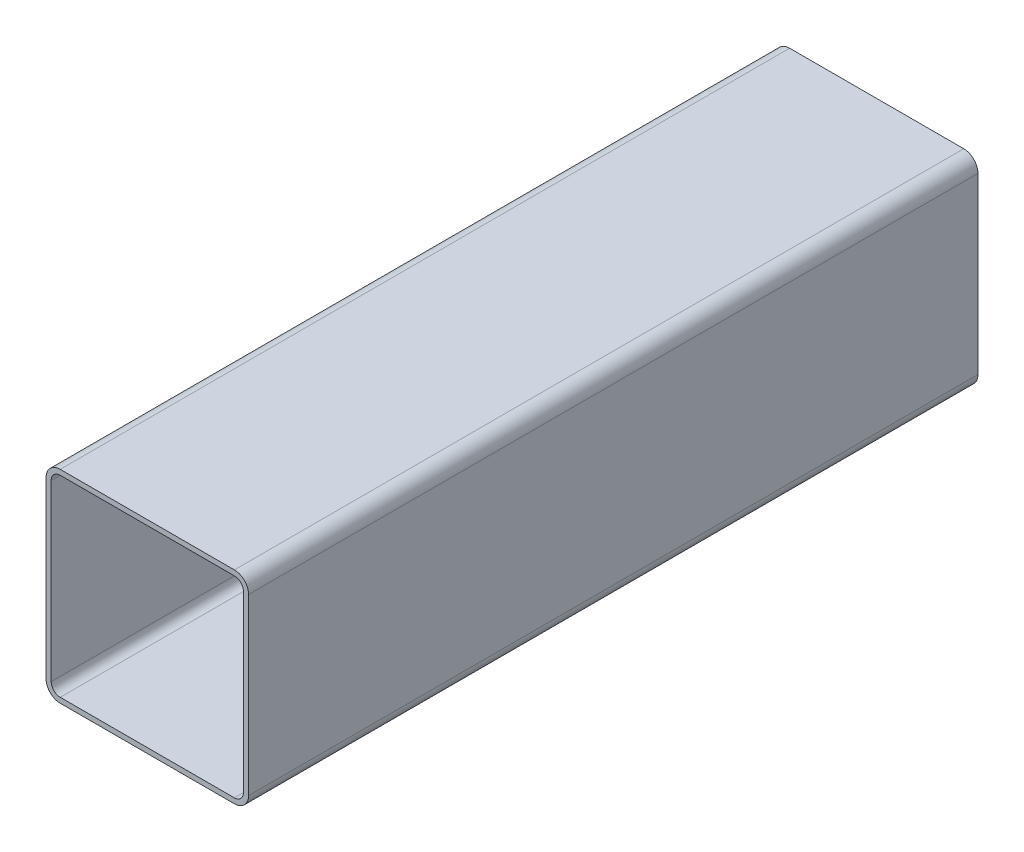
ISO-10303-21;
HEADER;
FILE_DESCRIPTION(('STEP AP214'),'2;1');
FILE_NAME('part.step','',(''),(''),'','','');
FILE_SCHEMA(('AUTOMOTIVE_DESIGN { 1 0 10303 214 1 1 1 1 }'));
ENDSEC;
DATA;
#1=APPLICATION_CONTEXT('core data for automotive mechanical design processes');
#2=APPLICATION_PROTOCOL_DEFINITION('international standard','automotive_design',2000,#1);
#3=PRODUCT_CONTEXT('',#1,'mechanical');
#4=PRODUCT('Part','Part','',(#3));
#5=PRODUCT_RELATED_PRODUCT_CATEGORY('part','',(#4));
#6=PRODUCT_DEFINITION_FORMATION('','',#4);
#7=PRODUCT_DEFINITION_CONTEXT('part definition',#1,'design');
#8=PRODUCT_DEFINITION('design','',#6,#7);
#9=PRODUCT_DEFINITION_SHAPE('','',#8);
#10=(LENGTH_UNIT() NAMED_UNIT(*) SI_UNIT(.MILLI.,.METRE.));
#11=(NAMED_UNIT(*) PLANE_ANGLE_UNIT() SI_UNIT($,.RADIAN.));
#12=(NAMED_UNIT(*) SI_UNIT($,.STERADIAN.) SOLID_ANGLE_UNIT());
#13=UNCERTAINTY_MEASURE_WITH_UNIT(LENGTH_MEASURE(1.E-05),#10,'distance_accuracy_value','');
#14=(GEOMETRIC_REPRESENTATION_CONTEXT(3) GLOBAL_UNCERTAINTY_ASSIGNED_CONTEXT((#13)) GLOBAL_UNIT_ASSIGNED_CONTEXT((#10,
#11,#12)) REPRESENTATION_CONTEXT('',''));
#15=CARTESIAN_POINT('',(0.,0.,0.));
#16=DIRECTION('',(0.,0.,1.));
#17=DIRECTION('',(1.,0.,0.));
#18=AXIS2_PLACEMENT_3D('',#15,#16,#17);
#19=CARTESIAN_POINT('',(36.3855,-36.3855,-304.8));
#20=DIRECTION('',(0.,0.,1.));
#21=DIRECTION('',(1.,0.,0.));
#22=AXIS2_PLACEMENT_3D('',#19,#20,#21);
#23=CYLINDRICAL_SURFACE('',#22,5.9436);
#24=CARTESIAN_POINT('',(36.3855,-36.3855,0.));
#25=DIRECTION('',(0.,0.,-1.));
#26=DIRECTION('',(-1.,0.,0.));
#27=AXIS2_PLACEMENT_3D('',#24,#25,#26);
#28=CIRCLE('',#27,5.9436);
#29=CARTESIAN_POINT('',(42.3291,-36.3855,0.));
#30=VERTEX_POINT('',#29);
#31=CARTESIAN_POINT('',(36.3855,-42.3291,0.));
#32=VERTEX_POINT('',#31);
#33=EDGE_CURVE('E234',#30,#32,#28,.T.);
#34=ORIENTED_EDGE('',*,*,#33,.T.);
#35=DIRECTION('',(0.,0.,1.));
#36=VECTOR('',#35,1.);
#37=CARTESIAN_POINT('',(36.3855,-42.3291,-304.8));
#38=LINE('',#37,#36);
#39=CARTESIAN_POINT('',(36.3855,-42.3291,-304.8));
#40=VERTEX_POINT('',#39);
#41=EDGE_CURVE('E12',#40,#32,#38,.T.);
#42=ORIENTED_EDGE('',*,*,#41,.F.);
#43=CARTESIAN_POINT('',(36.3855,-36.3855,-304.8));
#44=DIRECTION('',(0.,0.,-1.));
#45=DIRECTION('',(-1.,0.,0.));
#46=AXIS2_PLACEMENT_3D('',#43,#44,#45);
#47=CIRCLE('',#46,5.9436);
#48=CARTESIAN_POINT('',(42.3291,-36.3855,-304.8));
#49=VERTEX_POINT('',#48);
#50=EDGE_CURVE('E312',#49,#40,#47,.T.);
#51=ORIENTED_EDGE('',*,*,#50,.F.);
#52=DIRECTION('',(0.,0.,1.));
#53=VECTOR('',#52,1.);
#54=CARTESIAN_POINT('',(42.3291,-36.3855,-304.8));
#55=LINE('',#54,#53);
#56=EDGE_CURVE('E249',#49,#30,#55,.T.);
#57=ORIENTED_EDGE('',*,*,#56,.T.);
#58=EDGE_LOOP('',(#34,#42,#51,#57));
#59=FACE_BOUND('',#58,.T.);
#60=ADVANCED_FACE('F62',(#59),#23,.T.);
#61=CARTESIAN_POINT('',(36.3855,-42.3291,-304.8));
#62=DIRECTION('',(0.,1.,0.));
#63=DIRECTION('',(0.,0.,1.));
#64=AXIS2_PLACEMENT_3D('',#61,#62,#63);
#65=PLANE('',#64);
#66=DIRECTION('',(-1.,0.,0.));
#67=VECTOR('',#66,1.);
#68=CARTESIAN_POINT('',(36.3855,-42.3291,0.));
#69=LINE('',#68,#67);
#70=CARTESIAN_POINT('',(-36.3855,-42.3291,0.));
#71=VERTEX_POINT('',#70);
#72=EDGE_CURVE('E237',#32,#71,#69,.T.);
#73=ORIENTED_EDGE('',*,*,#72,.T.);
#74=DIRECTION('',(0.,0.,1.));
#75=VECTOR('',#74,1.);
#76=CARTESIAN_POINT('',(-36.3855,-42.3291,-304.8));
#77=LINE('',#76,#75);
#78=CARTESIAN_POINT('',(-36.3855,-42.3291,-304.8));
#79=VERTEX_POINT('',#78);
#80=EDGE_CURVE('E72',#79,#71,#77,.T.);
#81=ORIENTED_EDGE('',*,*,#80,.F.);
#82=DIRECTION('',(-1.,0.,0.));
#83=VECTOR('',#82,1.);
#84=CARTESIAN_POINT('',(36.3855,-42.3291,-304.8));
#85=LINE('',#84,#83);
#86=EDGE_CURVE('E314',#40,#79,#85,.T.);
#87=ORIENTED_EDGE('',*,*,#86,.F.);
#88=ORIENTED_EDGE('',*,*,#41,.T.);
#89=EDGE_LOOP('',(#73,#81,#87,#88));
#90=FACE_BOUND('',#89,.T.);
#91=ADVANCED_FACE('F349',(#90),#65,.F.);
#92=CARTESIAN_POINT('',(-36.3855,-36.3855,-304.8));
#93=DIRECTION('',(0.,0.,1.));
#94=DIRECTION('',(1.,0.,0.));
#95=AXIS2_PLACEMENT_3D('',#92,#93,#94);
#96=CYLINDRICAL_SURFACE('',#95,5.9436);
#97=CARTESIAN_POINT('',(-36.3855,-36.3855,0.));
#98=DIRECTION('',(0.,0.,-1.));
#99=DIRECTION('',(-1.,0.,0.));
#100=AXIS2_PLACEMENT_3D('',#97,#98,#99);
#101=CIRCLE('',#100,5.9436);
#102=CARTESIAN_POINT('',(-42.3291,-36.3855,0.));
#103=VERTEX_POINT('',#102);
#104=EDGE_CURVE('E239',#71,#103,#101,.T.);
#105=ORIENTED_EDGE('',*,*,#104,.T.);
#106=DIRECTION('',(0.,0.,1.));
#107=VECTOR('',#106,1.);
#108=CARTESIAN_POINT('',(-42.3291,-36.3855,-304.8));
#109=LINE('',#108,#107);
#110=CARTESIAN_POINT('',(-42.3291,-36.3855,-304.8));
#111=VERTEX_POINT('',#110);
#112=EDGE_CURVE('E256',#111,#103,#109,.T.);
#113=ORIENTED_EDGE('',*,*,#112,.F.);
#114=CARTESIAN_POINT('',(-36.3855,-36.3855,-304.8));
#115=DIRECTION('',(0.,0.,-1.));
#116=DIRECTION('',(-1.,0.,0.));
#117=AXIS2_PLACEMENT_3D('',#114,#115,#116);
#118=CIRCLE('',#117,5.9436);
#119=EDGE_CURVE('E316',#79,#111,#118,.T.);
#120=ORIENTED_EDGE('',*,*,#119,.F.);
#121=ORIENTED_EDGE('',*,*,#80,.T.);
#122=EDGE_LOOP('',(#105,#113,#120,#121));
#123=FACE_BOUND('',#122,.T.);
#124=ADVANCED_FACE('F354',(#123),#96,.T.);
#125=CARTESIAN_POINT('',(-42.3291,36.3855,-304.8));
#126=DIRECTION('',(1.,0.,0.));
#127=DIRECTION('',(0.,0.,-1.));
#128=AXIS2_PLACEMENT_3D('',#125,#126,#127);
#129=PLANE('',#128);
#130=DIRECTION('',(0.,1.,0.));
#131=VECTOR('',#130,1.);
#132=CARTESIAN_POINT('',(-42.3291,36.3855,0.));
#133=LINE('',#132,#131);
#134=CARTESIAN_POINT('',(-42.3291,36.3855,0.));
#135=VERTEX_POINT('',#134);
#136=EDGE_CURVE('E241',#103,#135,#133,.T.);
#137=ORIENTED_EDGE('',*,*,#136,.T.);
#138=DIRECTION('',(0.,0.,1.));
#139=VECTOR('',#138,1.);
#140=CARTESIAN_POINT('',(-42.3291,36.3855,-304.8));
#141=LINE('',#140,#139);
#142=CARTESIAN_POINT('',(-42.3291,36.3855,-304.8));
#143=VERTEX_POINT('',#142);
#144=EDGE_CURVE('E253',#143,#135,#141,.T.);
#145=ORIENTED_EDGE('',*,*,#144,.F.);
#146=DIRECTION('',(0.,1.,0.));
#147=VECTOR('',#146,1.);
#148=CARTESIAN_POINT('',(-42.3291,36.3855,-304.8));
#149=LINE('',#148,#147);
#150=EDGE_CURVE('E318',#111,#143,#149,.T.);
#151=ORIENTED_EDGE('',*,*,#150,.F.);
#152=ORIENTED_EDGE('',*,*,#112,.T.);
#153=EDGE_LOOP('',(#137,#145,#151,#152));
#154=FACE_BOUND('',#153,.T.);
#155=ADVANCED_FACE('F324',(#154),#129,.F.);
#156=CARTESIAN_POINT('',(-36.3855,36.3855,-304.8));
#157=DIRECTION('',(0.,0.,1.));
#158=DIRECTION('',(1.,0.,0.));
#159=AXIS2_PLACEMENT_3D('',#156,#157,#158);
#160=CYLINDRICAL_SURFACE('',#159,5.9436);
#161=CARTESIAN_POINT('',(-36.3855,36.3855,0.));
#162=DIRECTION('',(0.,0.,-1.));
#163=DIRECTION('',(1.,0.,0.));
#164=AXIS2_PLACEMENT_3D('',#161,#162,#163);
#165=CIRCLE('',#164,5.9436);
#166=CARTESIAN_POINT('',(-36.3855,42.3291,0.));
#167=VERTEX_POINT('',#166);
#168=EDGE_CURVE('E243',#135,#167,#165,.T.);
#169=ORIENTED_EDGE('',*,*,#168,.T.);
#170=DIRECTION('',(0.,0.,1.));
#171=VECTOR('',#170,1.);
#172=CARTESIAN_POINT('',(-36.3855,42.3291,-304.8));
#173=LINE('',#172,#171);
#174=CARTESIAN_POINT('',(-36.3855,42.3291,-304.8));
#175=VERTEX_POINT('',#174);
#176=EDGE_CURVE('E201',#175,#167,#173,.T.);
#177=ORIENTED_EDGE('',*,*,#176,.F.);
#178=CARTESIAN_POINT('',(-36.3855,36.3855,-304.8));
#179=DIRECTION('',(0.,0.,-1.));
#180=DIRECTION('',(1.,0.,0.));
#181=AXIS2_PLACEMENT_3D('',#178,#179,#180);
#182=CIRCLE('',#181,5.9436);
#183=EDGE_CURVE('E192',#143,#175,#182,.T.);
#184=ORIENTED_EDGE('',*,*,#183,.F.);
#185=ORIENTED_EDGE('',*,*,#144,.T.);
#186=EDGE_LOOP('',(#169,#177,#184,#185));
#187=FACE_BOUND('',#186,.T.);
#188=ADVANCED_FACE('F328',(#187),#160,.T.);
#189=CARTESIAN_POINT('',(36.3855,42.3291,-304.8));
#190=DIRECTION('',(0.,-1.,0.));
#191=DIRECTION('',(0.,0.,-1.));
#192=AXIS2_PLACEMENT_3D('',#189,#190,#191);
#193=PLANE('',#192);
#194=DIRECTION('',(1.,0.,0.));
#195=VECTOR('',#194,1.);
#196=CARTESIAN_POINT('',(36.3855,42.3291,0.));
#197=LINE('',#196,#195);
#198=CARTESIAN_POINT('',(36.3855,42.3291,0.));
#199=VERTEX_POINT('',#198);
#200=EDGE_CURVE('E200',#167,#199,#197,.T.);
#201=ORIENTED_EDGE('',*,*,#200,.T.);
#202=DIRECTION('',(0.,0.,1.));
#203=VECTOR('',#202,1.);
#204=CARTESIAN_POINT('',(36.3855,42.3291,-304.8));
#205=LINE('',#204,#203);
#206=CARTESIAN_POINT('',(36.3855,42.3291,-304.8));
#207=VERTEX_POINT('',#206);
#208=EDGE_CURVE('E197',#207,#199,#205,.T.);
#209=ORIENTED_EDGE('',*,*,#208,.F.);
#210=DIRECTION('',(1.,0.,0.));
#211=VECTOR('',#210,1.);
#212=CARTESIAN_POINT('',(36.3855,42.3291,-304.8));
#213=LINE('',#212,#211);
#214=EDGE_CURVE('E186',#175,#207,#213,.T.);
#215=ORIENTED_EDGE('',*,*,#214,.F.);
#216=ORIENTED_EDGE('',*,*,#176,.T.);
#217=EDGE_LOOP('',(#201,#209,#215,#216));
#218=FACE_BOUND('',#217,.T.);
#219=ADVANCED_FACE('F198',(#218),#193,.F.);
#220=CARTESIAN_POINT('',(36.3855,36.3855,-304.8));
#221=DIRECTION('',(0.,0.,1.));
#222=DIRECTION('',(1.,0.,0.));
#223=AXIS2_PLACEMENT_3D('',#220,#221,#222);
#224=CYLINDRICAL_SURFACE('',#223,5.9436);
#225=CARTESIAN_POINT('',(36.3855,36.3855,0.));
#226=DIRECTION('',(0.,0.,-1.));
#227=DIRECTION('',(1.,0.,0.));
#228=AXIS2_PLACEMENT_3D('',#225,#226,#227);
#229=CIRCLE('',#228,5.9436);
#230=CARTESIAN_POINT('',(42.3291,36.3855,0.));
#231=VERTEX_POINT('',#230);
#232=EDGE_CURVE('E134',#199,#231,#229,.T.);
#233=ORIENTED_EDGE('',*,*,#232,.T.);
#234=DIRECTION('',(0.,0.,1.));
#235=VECTOR('',#234,1.);
#236=CARTESIAN_POINT('',(42.3291,36.3855,-304.8));
#237=LINE('',#236,#235);
#238=CARTESIAN_POINT('',(42.3291,36.3855,-304.8));
#239=VERTEX_POINT('',#238);
#240=EDGE_CURVE('E202',#239,#231,#237,.T.);
#241=ORIENTED_EDGE('',*,*,#240,.F.);
#242=CARTESIAN_POINT('',(36.3855,36.3855,-304.8));
#243=DIRECTION('',(0.,0.,-1.));
#244=DIRECTION('',(1.,0.,0.));
#245=AXIS2_PLACEMENT_3D('',#242,#243,#244);
#246=CIRCLE('',#245,5.9436);
#247=EDGE_CURVE('E190',#207,#239,#246,.T.);
#248=ORIENTED_EDGE('',*,*,#247,.F.);
#249=ORIENTED_EDGE('',*,*,#208,.T.);
#250=EDGE_LOOP('',(#233,#241,#248,#249));
#251=FACE_BOUND('',#250,.T.);
#252=ADVANCED_FACE('F204',(#251),#224,.T.);
#253=CARTESIAN_POINT('',(36.3855,36.3855,-304.8));
#254=DIRECTION('',(0.,0.,1.));
#255=DIRECTION('',(1.,0.,0.));
#256=AXIS2_PLACEMENT_3D('',#253,#254,#255);
#257=CYLINDRICAL_SURFACE('',#256,3.7846);
#258=CARTESIAN_POINT('',(36.3855,36.3855,0.));
#259=DIRECTION('',(0.,0.,-1.));
#260=DIRECTION('',(1.,0.,0.));
#261=AXIS2_PLACEMENT_3D('',#258,#259,#260);
#262=CIRCLE('',#261,3.7846);
#263=CARTESIAN_POINT('',(36.3855,40.1701,0.));
#264=VERTEX_POINT('',#263);
#265=CARTESIAN_POINT('',(40.1701,36.3855,0.));
#266=VERTEX_POINT('',#265);
#267=EDGE_CURVE('E210',#264,#266,#262,.T.);
#268=ORIENTED_EDGE('',*,*,#267,.F.);
#269=DIRECTION('',(0.,0.,1.));
#270=VECTOR('',#269,1.);
#271=CARTESIAN_POINT('',(36.3855,40.1701,-304.8));
#272=LINE('',#271,#270);
#273=CARTESIAN_POINT('',(36.3855,40.1701,-304.8));
#274=VERTEX_POINT('',#273);
#275=EDGE_CURVE('E66',#274,#264,#272,.T.);
#276=ORIENTED_EDGE('',*,*,#275,.F.);
#277=CARTESIAN_POINT('',(36.3855,36.3855,-304.8));
#278=DIRECTION('',(0.,0.,-1.));
#279=DIRECTION('',(1.,0.,0.));
#280=AXIS2_PLACEMENT_3D('',#277,#278,#279);
#281=CIRCLE('',#280,3.7846);
#282=CARTESIAN_POINT('',(40.1701,36.3855,-304.8));
#283=VERTEX_POINT('',#282);
#284=EDGE_CURVE('E248',#274,#283,#281,.T.);
#285=ORIENTED_EDGE('',*,*,#284,.T.);
#286=DIRECTION('',(0.,0.,1.));
#287=VECTOR('',#286,1.);
#288=CARTESIAN_POINT('',(40.1701,36.3855,-304.8));
#289=LINE('',#288,#287);
#290=EDGE_CURVE('E206',#283,#266,#289,.T.);
#291=ORIENTED_EDGE('',*,*,#290,.T.);
#292=EDGE_LOOP('',(#268,#276,#285,#291));
#293=FACE_BOUND('',#292,.T.);
#294=ADVANCED_FACE('F64',(#293),#257,.F.);
#295=CARTESIAN_POINT('',(36.3855,40.1701,-304.8));
#296=DIRECTION('',(0.,-1.,0.));
#297=DIRECTION('',(0.,0.,-1.));
#298=AXIS2_PLACEMENT_3D('',#295,#296,#297);
#299=PLANE('',#298);
#300=DIRECTION('',(1.,0.,0.));
#301=VECTOR('',#300,1.);
#302=CARTESIAN_POINT('',(36.3855,40.1701,0.));
#303=LINE('',#302,#301);
#304=CARTESIAN_POINT('',(-36.3855,40.1701,0.));
#305=VERTEX_POINT('',#304);
#306=EDGE_CURVE('E213',#305,#264,#303,.T.);
#307=ORIENTED_EDGE('',*,*,#306,.F.);
#308=DIRECTION('',(0.,0.,1.));
#309=VECTOR('',#308,1.);
#310=CARTESIAN_POINT('',(-36.3855,40.1701,-304.8));
#311=LINE('',#310,#309);
#312=CARTESIAN_POINT('',(-36.3855,40.1701,-304.8));
#313=VERTEX_POINT('',#312);
#314=EDGE_CURVE('E271',#313,#305,#311,.T.);
#315=ORIENTED_EDGE('',*,*,#314,.F.);
#316=DIRECTION('',(1.,0.,0.));
#317=VECTOR('',#316,1.);
#318=CARTESIAN_POINT('',(36.3855,40.1701,-304.8));
#319=LINE('',#318,#317);
#320=EDGE_CURVE('E280',#313,#274,#319,.T.);
#321=ORIENTED_EDGE('',*,*,#320,.T.);
#322=ORIENTED_EDGE('',*,*,#275,.T.);
#323=EDGE_LOOP('',(#307,#315,#321,#322));
#324=FACE_BOUND('',#323,.T.);
#325=ADVANCED_FACE('F278',(#324),#299,.T.);
#326=CARTESIAN_POINT('',(-36.3855,36.3855,-304.8));
#327=DIRECTION('',(0.,0.,1.));
#328=DIRECTION('',(1.,0.,0.));
#329=AXIS2_PLACEMENT_3D('',#326,#327,#328);
#330=CYLINDRICAL_SURFACE('',#329,3.7846);
#331=CARTESIAN_POINT('',(-36.3855,36.3855,0.));
#332=DIRECTION('',(0.,0.,-1.));
#333=DIRECTION('',(1.,0.,0.));
#334=AXIS2_PLACEMENT_3D('',#331,#332,#333);
#335=CIRCLE('',#334,3.7846);
#336=CARTESIAN_POINT('',(-40.1701,36.3855,0.));
#337=VERTEX_POINT('',#336);
#338=EDGE_CURVE('E216',#337,#305,#335,.T.);
#339=ORIENTED_EDGE('',*,*,#338,.F.);
#340=DIRECTION('',(0.,0.,1.));
#341=VECTOR('',#340,1.);
#342=CARTESIAN_POINT('',(-40.1701,36.3855,-304.8));
#343=LINE('',#342,#341);
#344=CARTESIAN_POINT('',(-40.1701,36.3855,-304.8));
#345=VERTEX_POINT('',#344);
#346=EDGE_CURVE('E270',#345,#337,#343,.T.);
#347=ORIENTED_EDGE('',*,*,#346,.F.);
#348=CARTESIAN_POINT('',(-36.3855,36.3855,-304.8));
#349=DIRECTION('',(0.,0.,-1.));
#350=DIRECTION('',(1.,0.,0.));
#351=AXIS2_PLACEMENT_3D('',#348,#349,#350);
#352=CIRCLE('',#351,3.7846);
#353=EDGE_CURVE('E288',#345,#313,#352,.T.);
#354=ORIENTED_EDGE('',*,*,#353,.T.);
#355=ORIENTED_EDGE('',*,*,#314,.T.);
#356=EDGE_LOOP('',(#339,#347,#354,#355));
#357=FACE_BOUND('',#356,.T.);
#358=ADVANCED_FACE('F286',(#357),#330,.F.);
#359=CARTESIAN_POINT('',(-40.1701,36.3855,-304.8));
#360=DIRECTION('',(1.,0.,0.));
#361=DIRECTION('',(0.,1.,0.));
#362=AXIS2_PLACEMENT_3D('',#359,#360,#361);
#363=PLANE('',#362);
#364=DIRECTION('',(0.,1.,0.));
#365=VECTOR('',#364,1.);
#366=CARTESIAN_POINT('',(-40.1701,36.3855,0.));
#367=LINE('',#366,#365);
#368=CARTESIAN_POINT('',(-40.1701,-36.3855,0.));
#369=VERTEX_POINT('',#368);
#370=EDGE_CURVE('E219',#369,#337,#367,.T.);
#371=ORIENTED_EDGE('',*,*,#370,.F.);
#372=DIRECTION('',(0.,0.,1.));
#373=VECTOR('',#372,1.);
#374=CARTESIAN_POINT('',(-40.1701,-36.3855,-304.8));
#375=LINE('',#374,#373);
#376=CARTESIAN_POINT('',(-40.1701,-36.3855,-304.8));
#377=VERTEX_POINT('',#376);
#378=EDGE_CURVE('E268',#377,#369,#375,.T.);
#379=ORIENTED_EDGE('',*,*,#378,.F.);
#380=DIRECTION('',(0.,1.,0.));
#381=VECTOR('',#380,1.);
#382=CARTESIAN_POINT('',(-40.1701,36.3855,-304.8));
#383=LINE('',#382,#381);
#384=EDGE_CURVE('E294',#377,#345,#383,.T.);
#385=ORIENTED_EDGE('',*,*,#384,.T.);
#386=ORIENTED_EDGE('',*,*,#346,.T.);
#387=EDGE_LOOP('',(#371,#379,#385,#386));
#388=FACE_BOUND('',#387,.T.);
#389=ADVANCED_FACE('F297',(#388),#363,.T.);
#390=CARTESIAN_POINT('',(-36.3855,-36.3855,-304.8));
#391=DIRECTION('',(0.,0.,1.));
#392=DIRECTION('',(1.,0.,0.));
#393=AXIS2_PLACEMENT_3D('',#390,#391,#392);
#394=CYLINDRICAL_SURFACE('',#393,3.7846);
#395=CARTESIAN_POINT('',(-36.3855,-36.3855,0.));
#396=DIRECTION('',(0.,0.,-1.));
#397=DIRECTION('',(-1.,0.,0.));
#398=AXIS2_PLACEMENT_3D('',#395,#396,#397);
#399=CIRCLE('',#398,3.7846);
#400=CARTESIAN_POINT('',(-36.3855,-40.1701,0.));
#401=VERTEX_POINT('',#400);
#402=EDGE_CURVE('E222',#401,#369,#399,.T.);
#403=ORIENTED_EDGE('',*,*,#402,.F.);
#404=DIRECTION('',(0.,0.,1.));
#405=VECTOR('',#404,1.);
#406=CARTESIAN_POINT('',(-36.3855,-40.1701,-304.8));
#407=LINE('',#406,#405);
#408=CARTESIAN_POINT('',(-36.3855,-40.1701,-304.8));
#409=VERTEX_POINT('',#408);
#410=EDGE_CURVE('E266',#409,#401,#407,.T.);
#411=ORIENTED_EDGE('',*,*,#410,.F.);
#412=CARTESIAN_POINT('',(-36.3855,-36.3855,-304.8));
#413=DIRECTION('',(0.,0.,-1.));
#414=DIRECTION('',(-1.,0.,0.));
#415=AXIS2_PLACEMENT_3D('',#412,#413,#414);
#416=CIRCLE('',#415,3.7846);
#417=EDGE_CURVE('E298',#409,#377,#416,.T.);
#418=ORIENTED_EDGE('',*,*,#417,.T.);
#419=ORIENTED_EDGE('',*,*,#378,.T.);
#420=EDGE_LOOP('',(#403,#411,#418,#419));
#421=FACE_BOUND('',#420,.T.);
#422=ADVANCED_FACE('F365',(#421),#394,.F.);
#423=CARTESIAN_POINT('',(36.3855,-40.1701,-304.8));
#424=DIRECTION('',(0.,1.,0.));
#425=DIRECTION('',(0.,0.,1.));
#426=AXIS2_PLACEMENT_3D('',#423,#424,#425);
#427=PLANE('',#426);
#428=DIRECTION('',(-1.,0.,0.));
#429=VECTOR('',#428,1.);
#430=CARTESIAN_POINT('',(36.3855,-40.1701,0.));
#431=LINE('',#430,#429);
#432=CARTESIAN_POINT('',(36.3855,-40.1701,0.));
#433=VERTEX_POINT('',#432);
#434=EDGE_CURVE('E225',#433,#401,#431,.T.);
#435=ORIENTED_EDGE('',*,*,#434,.F.);
#436=DIRECTION('',(0.,0.,1.));
#437=VECTOR('',#436,1.);
#438=CARTESIAN_POINT('',(36.3855,-40.1701,-304.8));
#439=LINE('',#438,#437);
#440=CARTESIAN_POINT('',(36.3855,-40.1701,-304.8));
#441=VERTEX_POINT('',#440);
#442=EDGE_CURVE('E264',#441,#433,#439,.T.);
#443=ORIENTED_EDGE('',*,*,#442,.F.);
#444=DIRECTION('',(-1.,0.,0.));
#445=VECTOR('',#444,1.);
#446=CARTESIAN_POINT('',(36.3855,-40.1701,-304.8));
#447=LINE('',#446,#445);
#448=EDGE_CURVE('E300',#441,#409,#447,.T.);
#449=ORIENTED_EDGE('',*,*,#448,.T.);
#450=ORIENTED_EDGE('',*,*,#410,.T.);
#451=EDGE_LOOP('',(#435,#443,#449,#450));
#452=FACE_BOUND('',#451,.T.);
#453=ADVANCED_FACE('F361',(#452),#427,.T.);
#454=CARTESIAN_POINT('',(36.3855,-36.3855,-304.8));
#455=DIRECTION('',(0.,0.,1.));
#456=DIRECTION('',(1.,0.,0.));
#457=AXIS2_PLACEMENT_3D('',#454,#455,#456);
#458=CYLINDRICAL_SURFACE('',#457,3.7846);
#459=CARTESIAN_POINT('',(36.3855,-36.3855,0.));
#460=DIRECTION('',(0.,0.,-1.));
#461=DIRECTION('',(-1.,0.,0.));
#462=AXIS2_PLACEMENT_3D('',#459,#460,#461);
#463=CIRCLE('',#462,3.7846);
#464=CARTESIAN_POINT('',(40.1701,-36.3855,0.));
#465=VERTEX_POINT('',#464);
#466=EDGE_CURVE('E228',#465,#433,#463,.T.);
#467=ORIENTED_EDGE('',*,*,#466,.F.);
#468=DIRECTION('',(0.,0.,1.));
#469=VECTOR('',#468,1.);
#470=CARTESIAN_POINT('',(40.1701,-36.3855,-304.8));
#471=LINE('',#470,#469);
#472=CARTESIAN_POINT('',(40.1701,-36.3855,-304.8));
#473=VERTEX_POINT('',#472);
#474=EDGE_CURVE('E262',#473,#465,#471,.T.);
#475=ORIENTED_EDGE('',*,*,#474,.F.);
#476=CARTESIAN_POINT('',(36.3855,-36.3855,-304.8));
#477=DIRECTION('',(0.,0.,-1.));
#478=DIRECTION('',(-1.,0.,0.));
#479=AXIS2_PLACEMENT_3D('',#476,#477,#478);
#480=CIRCLE('',#479,3.7846);
#481=EDGE_CURVE('E306',#473,#441,#480,.T.);
#482=ORIENTED_EDGE('',*,*,#481,.T.);
#483=ORIENTED_EDGE('',*,*,#442,.T.);
#484=EDGE_LOOP('',(#467,#475,#482,#483));
#485=FACE_BOUND('',#484,.T.);
#486=ADVANCED_FACE('F343',(#485),#458,.F.);
#487=CARTESIAN_POINT('',(40.1701,36.3855,-304.8));
#488=DIRECTION('',(-1.,0.,0.));
#489=DIRECTION('',(0.,-1.,0.));
#490=AXIS2_PLACEMENT_3D('',#487,#488,#489);
#491=PLANE('',#490);
#492=DIRECTION('',(0.,-1.,0.));
#493=VECTOR('',#492,1.);
#494=CARTESIAN_POINT('',(40.1701,36.3855,0.));
#495=LINE('',#494,#493);
#496=EDGE_CURVE('E231',#266,#465,#495,.T.);
#497=ORIENTED_EDGE('',*,*,#496,.F.);
#498=ORIENTED_EDGE('',*,*,#290,.F.);
#499=DIRECTION('',(0.,-1.,0.));
#500=VECTOR('',#499,1.);
#501=CARTESIAN_POINT('',(40.1701,36.3855,-304.8));
#502=LINE('',#501,#500);
#503=EDGE_CURVE('E309',#283,#473,#502,.T.);
#504=ORIENTED_EDGE('',*,*,#503,.T.);
#505=ORIENTED_EDGE('',*,*,#474,.T.);
#506=EDGE_LOOP('',(#497,#498,#504,#505));
#507=FACE_BOUND('',#506,.T.);
#508=ADVANCED_FACE('F336',(#507),#491,.T.);
#509=CARTESIAN_POINT('',(42.3291,36.3855,-304.8));
#510=DIRECTION('',(-1.,0.,0.));
#511=DIRECTION('',(0.,-1.,0.));
#512=AXIS2_PLACEMENT_3D('',#509,#510,#511);
#513=PLANE('',#512);
#514=DIRECTION('',(0.,-1.,0.));
#515=VECTOR('',#514,1.);
#516=CARTESIAN_POINT('',(42.3291,36.3855,0.));
#517=LINE('',#516,#515);
#518=EDGE_CURVE('E140',#231,#30,#517,.T.);
#519=ORIENTED_EDGE('',*,*,#518,.T.);
#520=ORIENTED_EDGE('',*,*,#56,.F.);
#521=DIRECTION('',(0.,-1.,0.));
#522=VECTOR('',#521,1.);
#523=CARTESIAN_POINT('',(42.3291,36.3855,-304.8));
#524=LINE('',#523,#522);
#525=EDGE_CURVE('E81',#239,#49,#524,.T.);
#526=ORIENTED_EDGE('',*,*,#525,.F.);
#527=ORIENTED_EDGE('',*,*,#240,.T.);
#528=EDGE_LOOP('',(#519,#520,#526,#527));
#529=FACE_BOUND('',#528,.T.);
#530=ADVANCED_FACE('F334',(#529),#513,.F.);
#531=CARTESIAN_POINT('',(36.3855,-36.3855,-304.8));
#532=DIRECTION('',(0.,0.,-1.));
#533=DIRECTION('',(-1.,0.,0.));
#534=AXIS2_PLACEMENT_3D('',#531,#532,#533);
#535=PLANE('',#534);
#536=ORIENTED_EDGE('',*,*,#284,.F.);
#537=ORIENTED_EDGE('',*,*,#320,.F.);
#538=ORIENTED_EDGE('',*,*,#353,.F.);
#539=ORIENTED_EDGE('',*,*,#384,.F.);
#540=ORIENTED_EDGE('',*,*,#417,.F.);
#541=ORIENTED_EDGE('',*,*,#448,.F.);
#542=ORIENTED_EDGE('',*,*,#481,.F.);
#543=ORIENTED_EDGE('',*,*,#503,.F.);
#544=EDGE_LOOP('',(#536,#537,#538,#539,#540,#541,#542,#543));
#545=FACE_BOUND('',#544,.T.);
#546=ORIENTED_EDGE('',*,*,#50,.T.);
#547=ORIENTED_EDGE('',*,*,#86,.T.);
#548=ORIENTED_EDGE('',*,*,#119,.T.);
#549=ORIENTED_EDGE('',*,*,#150,.T.);
#550=ORIENTED_EDGE('',*,*,#183,.T.);
#551=ORIENTED_EDGE('',*,*,#214,.T.);
#552=ORIENTED_EDGE('',*,*,#247,.T.);
#553=ORIENTED_EDGE('',*,*,#525,.T.);
#554=EDGE_LOOP('',(#546,#547,#548,#549,#550,#551,#552,#553));
#555=FACE_BOUND('',#554,.T.);
#556=ADVANCED_FACE('F188',(#545,#555),#535,.T.);
#557=CARTESIAN_POINT('',(36.3855,-36.3855,0.));
#558=DIRECTION('',(0.,0.,-1.));
#559=DIRECTION('',(-1.,0.,0.));
#560=AXIS2_PLACEMENT_3D('',#557,#558,#559);
#561=PLANE('',#560);
#562=ORIENTED_EDGE('',*,*,#267,.T.);
#563=ORIENTED_EDGE('',*,*,#496,.T.);
#564=ORIENTED_EDGE('',*,*,#466,.T.);
#565=ORIENTED_EDGE('',*,*,#434,.T.);
#566=ORIENTED_EDGE('',*,*,#402,.T.);
#567=ORIENTED_EDGE('',*,*,#370,.T.);
#568=ORIENTED_EDGE('',*,*,#338,.T.);
#569=ORIENTED_EDGE('',*,*,#306,.T.);
#570=EDGE_LOOP('',(#562,#563,#564,#565,#566,#567,#568,#569));
#571=FACE_BOUND('',#570,.T.);
#572=ORIENTED_EDGE('',*,*,#33,.F.);
#573=ORIENTED_EDGE('',*,*,#518,.F.);
#574=ORIENTED_EDGE('',*,*,#232,.F.);
#575=ORIENTED_EDGE('',*,*,#200,.F.);
#576=ORIENTED_EDGE('',*,*,#168,.F.);
#577=ORIENTED_EDGE('',*,*,#136,.F.);
#578=ORIENTED_EDGE('',*,*,#104,.F.);
#579=ORIENTED_EDGE('',*,*,#72,.F.);
#580=EDGE_LOOP('',(#572,#573,#574,#575,#576,#577,#578,#579));
#581=FACE_BOUND('',#580,.T.);
#582=ADVANCED_FACE('F283',(#571,#581),#561,.F.);
#583=CLOSED_SHELL('',(#60,#91,#124,#155,#188,#219,#252,#294,#325,#358,#389,#422,#453,#486,#508,
#530,#556,#582));
#584=MANIFOLD_SOLID_BREP('B2',#583);
#585=ADVANCED_BREP_SHAPE_REPRESENTATION('',(#18,#584),#14);
#586=SHAPE_DEFINITION_REPRESENTATION(#9,#585);
ENDSEC;
END-ISO-10303-21;
